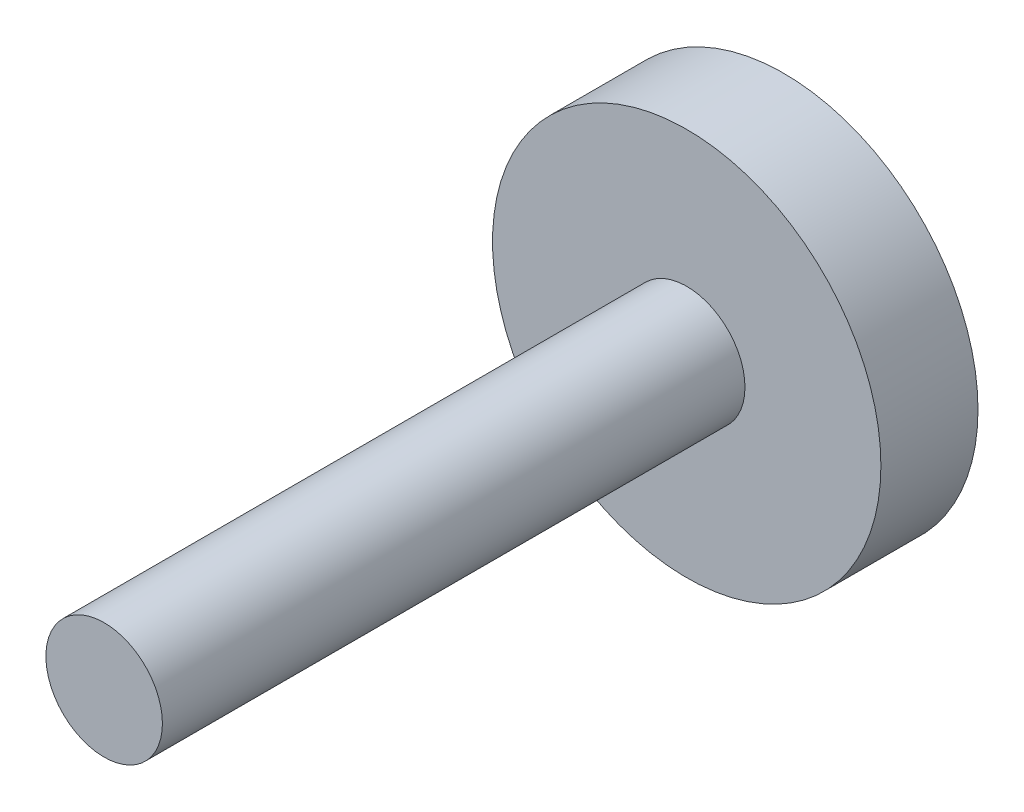
ISO-10303-21;
HEADER;
FILE_DESCRIPTION(('STEP AP214'),'2;1');
FILE_NAME('part.step','',(''),(''),'','','');
FILE_SCHEMA(('AUTOMOTIVE_DESIGN { 1 0 10303 214 1 1 1 1 }'));
ENDSEC;
DATA;
#1=APPLICATION_CONTEXT('core data for automotive mechanical design processes');
#2=APPLICATION_PROTOCOL_DEFINITION('international standard','automotive_design',2000,#1);
#3=PRODUCT_CONTEXT('',#1,'mechanical');
#4=PRODUCT('Part','Part','',(#3));
#5=PRODUCT_RELATED_PRODUCT_CATEGORY('part','',(#4));
#6=PRODUCT_DEFINITION_FORMATION('','',#4);
#7=PRODUCT_DEFINITION_CONTEXT('part definition',#1,'design');
#8=PRODUCT_DEFINITION('design','',#6,#7);
#9=PRODUCT_DEFINITION_SHAPE('','',#8);
#10=(LENGTH_UNIT() NAMED_UNIT(*) SI_UNIT(.MILLI.,.METRE.));
#11=(NAMED_UNIT(*) PLANE_ANGLE_UNIT() SI_UNIT($,.RADIAN.));
#12=(NAMED_UNIT(*) SI_UNIT($,.STERADIAN.) SOLID_ANGLE_UNIT());
#13=UNCERTAINTY_MEASURE_WITH_UNIT(LENGTH_MEASURE(1.E-05),#10,'distance_accuracy_value','');
#14=(GEOMETRIC_REPRESENTATION_CONTEXT(3) GLOBAL_UNCERTAINTY_ASSIGNED_CONTEXT((#13)) GLOBAL_UNIT_ASSIGNED_CONTEXT((#10,
#11,#12)) REPRESENTATION_CONTEXT('',''));
#15=CARTESIAN_POINT('',(0.,0.,0.));
#16=DIRECTION('',(0.,0.,1.));
#17=DIRECTION('',(1.,0.,0.));
#18=AXIS2_PLACEMENT_3D('',#15,#16,#17);
#19=CARTESIAN_POINT('',(0.,0.,1.25));
#20=DIRECTION('',(0.,0.,-1.));
#21=DIRECTION('',(-1.,0.,0.));
#22=AXIS2_PLACEMENT_3D('',#19,#20,#21);
#23=CYLINDRICAL_SURFACE('',#22,5.);
#24=CARTESIAN_POINT('',(0.,0.,1.25));
#25=DIRECTION('',(0.,0.,1.));
#26=DIRECTION('',(1.,0.,0.));
#27=AXIS2_PLACEMENT_3D('',#24,#25,#26);
#28=CIRCLE('',#27,5.);
#29=CARTESIAN_POINT('',(5.,0.,1.25));
#30=VERTEX_POINT('',#29);
#31=EDGE_CURVE('E45',#30,#30,#28,.T.);
#32=ORIENTED_EDGE('',*,*,#31,.F.);
#33=EDGE_LOOP('',(#32));
#34=FACE_BOUND('',#33,.T.);
#35=CARTESIAN_POINT('',(0.,0.,-1.25));
#36=DIRECTION('',(0.,0.,1.));
#37=DIRECTION('',(1.,0.,0.));
#38=AXIS2_PLACEMENT_3D('',#35,#36,#37);
#39=CIRCLE('',#38,5.);
#40=CARTESIAN_POINT('',(5.,0.,-1.25));
#41=VERTEX_POINT('',#40);
#42=EDGE_CURVE('E40',#41,#41,#39,.T.);
#43=ORIENTED_EDGE('',*,*,#42,.T.);
#44=EDGE_LOOP('',(#43));
#45=FACE_BOUND('',#44,.T.);
#46=ADVANCED_FACE('F37',(#34,#45),#23,.T.);
#47=CARTESIAN_POINT('',(0.,0.,1.25));
#48=DIRECTION('',(0.,0.,1.));
#49=DIRECTION('',(1.,0.,0.));
#50=AXIS2_PLACEMENT_3D('',#47,#48,#49);
#51=PLANE('',#50);
#52=CARTESIAN_POINT('',(0.,0.,1.25));
#53=DIRECTION('',(0.,0.,1.));
#54=DIRECTION('',(1.,0.,0.));
#55=AXIS2_PLACEMENT_3D('',#52,#53,#54);
#56=CIRCLE('',#55,1.5);
#57=CARTESIAN_POINT('',(1.5,0.,1.25));
#58=VERTEX_POINT('',#57);
#59=EDGE_CURVE('E10',#58,#58,#56,.T.);
#60=ORIENTED_EDGE('',*,*,#59,.F.);
#61=EDGE_LOOP('',(#60));
#62=FACE_BOUND('',#61,.T.);
#63=ORIENTED_EDGE('',*,*,#31,.T.);
#64=EDGE_LOOP('',(#63));
#65=FACE_BOUND('',#64,.T.);
#66=ADVANCED_FACE('F65',(#62,#65),#51,.T.);
#67=CARTESIAN_POINT('',(0.,0.,-1.25));
#68=DIRECTION('',(0.,0.,1.));
#69=DIRECTION('',(1.,0.,0.));
#70=AXIS2_PLACEMENT_3D('',#67,#68,#69);
#71=PLANE('',#70);
#72=ORIENTED_EDGE('',*,*,#42,.F.);
#73=EDGE_LOOP('',(#72));
#74=FACE_BOUND('',#73,.T.);
#75=ADVANCED_FACE('F62',(#74),#71,.F.);
#76=CARTESIAN_POINT('',(0.,0.,16.25));
#77=DIRECTION('',(0.,0.,-1.));
#78=DIRECTION('',(-1.,0.,0.));
#79=AXIS2_PLACEMENT_3D('',#76,#77,#78);
#80=CYLINDRICAL_SURFACE('',#79,1.5);
#81=CARTESIAN_POINT('',(0.,0.,16.25));
#82=DIRECTION('',(0.,0.,1.));
#83=DIRECTION('',(1.,0.,0.));
#84=AXIS2_PLACEMENT_3D('',#81,#82,#83);
#85=CIRCLE('',#84,1.5);
#86=CARTESIAN_POINT('',(1.5,0.,16.25));
#87=VERTEX_POINT('',#86);
#88=EDGE_CURVE('E52',#87,#87,#85,.T.);
#89=ORIENTED_EDGE('',*,*,#88,.F.);
#90=EDGE_LOOP('',(#89));
#91=FACE_BOUND('',#90,.T.);
#92=ORIENTED_EDGE('',*,*,#59,.T.);
#93=EDGE_LOOP('',(#92));
#94=FACE_BOUND('',#93,.T.);
#95=ADVANCED_FACE('F64',(#91,#94),#80,.T.);
#96=CARTESIAN_POINT('',(0.,0.,16.25));
#97=DIRECTION('',(0.,0.,1.));
#98=DIRECTION('',(1.,0.,0.));
#99=AXIS2_PLACEMENT_3D('',#96,#97,#98);
#100=PLANE('',#99);
#101=ORIENTED_EDGE('',*,*,#88,.T.);
#102=EDGE_LOOP('',(#101));
#103=FACE_BOUND('',#102,.T.);
#104=ADVANCED_FACE('F70',(#103),#100,.T.);
#105=CLOSED_SHELL('',(#46,#66,#75,#95,#104));
#106=MANIFOLD_SOLID_BREP('B2',#105);
#107=ADVANCED_BREP_SHAPE_REPRESENTATION('',(#18,#106),#14);
#108=SHAPE_DEFINITION_REPRESENTATION(#9,#107);
ENDSEC;
END-ISO-10303-21;
